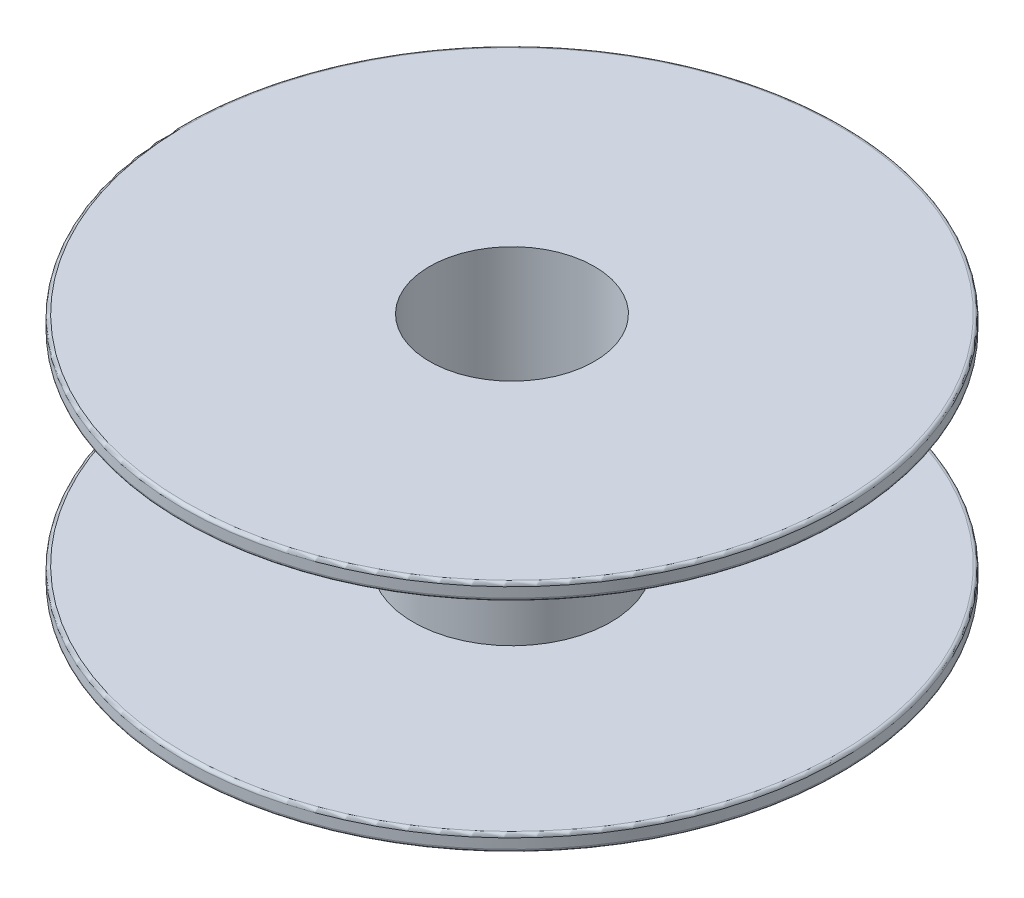
ISO-10303-21;
HEADER;
FILE_DESCRIPTION(('STEP AP214'),'2;1');
FILE_NAME('part.step','',(''),(''),'','','');
FILE_SCHEMA(('AUTOMOTIVE_DESIGN { 1 0 10303 214 1 1 1 1 }'));
ENDSEC;
DATA;
#1=APPLICATION_CONTEXT('core data for automotive mechanical design processes');
#2=APPLICATION_PROTOCOL_DEFINITION('international standard','automotive_design',2000,#1);
#3=PRODUCT_CONTEXT('',#1,'mechanical');
#4=PRODUCT('Part','Part','',(#3));
#5=PRODUCT_RELATED_PRODUCT_CATEGORY('part','',(#4));
#6=PRODUCT_DEFINITION_FORMATION('','',#4);
#7=PRODUCT_DEFINITION_CONTEXT('part definition',#1,'design');
#8=PRODUCT_DEFINITION('design','',#6,#7);
#9=PRODUCT_DEFINITION_SHAPE('','',#8);
#10=(LENGTH_UNIT() NAMED_UNIT(*) SI_UNIT(.MILLI.,.METRE.));
#11=(NAMED_UNIT(*) PLANE_ANGLE_UNIT() SI_UNIT($,.RADIAN.));
#12=(NAMED_UNIT(*) SI_UNIT($,.STERADIAN.) SOLID_ANGLE_UNIT());
#13=UNCERTAINTY_MEASURE_WITH_UNIT(LENGTH_MEASURE(1.E-05),#10,'distance_accuracy_value','');
#14=(GEOMETRIC_REPRESENTATION_CONTEXT(3) GLOBAL_UNCERTAINTY_ASSIGNED_CONTEXT((#13)) GLOBAL_UNIT_ASSIGNED_CONTEXT((#10,
#11,#12)) REPRESENTATION_CONTEXT('',''));
#15=CARTESIAN_POINT('',(0.,0.,0.));
#16=DIRECTION('',(0.,0.,1.));
#17=DIRECTION('',(1.,0.,0.));
#18=AXIS2_PLACEMENT_3D('',#15,#16,#17);
#19=CARTESIAN_POINT('',(0.,0.,0.));
#20=DIRECTION('',(0.,-1.,0.));
#21=DIRECTION('',(0.,0.,-1.));
#22=AXIS2_PLACEMENT_3D('',#19,#20,#21);
#23=CYLINDRICAL_SURFACE('',#22,25.);
#24=CARTESIAN_POINT('',(0.,0.,0.));
#25=DIRECTION('',(0.,-1.,0.));
#26=DIRECTION('',(0.,0.,-1.));
#27=AXIS2_PLACEMENT_3D('',#24,#25,#26);
#28=CIRCLE('',#27,25.);
#29=CARTESIAN_POINT('',(0.,0.,-25.));
#30=VERTEX_POINT('',#29);
#31=EDGE_CURVE('E65',#30,#30,#28,.T.);
#32=ORIENTED_EDGE('',*,*,#31,.T.);
#33=EDGE_LOOP('',(#32));
#34=FACE_BOUND('',#33,.T.);
#35=CARTESIAN_POINT('',(0.,71.,0.));
#36=DIRECTION('',(0.,-1.,0.));
#37=DIRECTION('',(0.,0.,-1.));
#38=AXIS2_PLACEMENT_3D('',#35,#36,#37);
#39=CIRCLE('',#38,25.);
#40=CARTESIAN_POINT('',(0.,71.,-25.));
#41=VERTEX_POINT('',#40);
#42=EDGE_CURVE('E74',#41,#41,#39,.T.);
#43=ORIENTED_EDGE('',*,*,#42,.F.);
#44=EDGE_LOOP('',(#43));
#45=FACE_BOUND('',#44,.T.);
#46=ADVANCED_FACE('F33',(#34,#45),#23,.F.);
#47=CARTESIAN_POINT('',(0.,0.,-25.));
#48=DIRECTION('',(0.,-1.,0.));
#49=DIRECTION('',(0.,0.,-1.));
#50=AXIS2_PLACEMENT_3D('',#47,#48,#49);
#51=PLANE('',#50);
#52=CARTESIAN_POINT('',(0.,0.,0.));
#53=DIRECTION('',(0.,-1.,0.));
#54=DIRECTION('',(0.,0.,-1.));
#55=AXIS2_PLACEMENT_3D('',#52,#53,#54);
#56=CIRCLE('',#55,99.);
#57=CARTESIAN_POINT('',(0.,0.,-99.));
#58=VERTEX_POINT('',#57);
#59=EDGE_CURVE('E62',#58,#58,#56,.T.);
#60=ORIENTED_EDGE('',*,*,#59,.T.);
#61=EDGE_LOOP('',(#60));
#62=FACE_BOUND('',#61,.T.);
#63=ORIENTED_EDGE('',*,*,#31,.F.);
#64=EDGE_LOOP('',(#63));
#65=FACE_BOUND('',#64,.T.);
#66=ADVANCED_FACE('F81',(#62,#65),#51,.T.);
#67=CARTESIAN_POINT('',(0.,0.,0.));
#68=DIRECTION('',(0.,-1.,0.));
#69=DIRECTION('',(0.,0.,-1.));
#70=AXIS2_PLACEMENT_3D('',#67,#68,#69);
#71=CYLINDRICAL_SURFACE('',#70,100.);
#72=CARTESIAN_POINT('',(0.,1.,0.));
#73=DIRECTION('',(0.,-1.,0.));
#74=DIRECTION('',(0.,0.,-1.));
#75=AXIS2_PLACEMENT_3D('',#72,#73,#74);
#76=CIRCLE('',#75,100.);
#77=CARTESIAN_POINT('',(0.,1.,-100.));
#78=VERTEX_POINT('',#77);
#79=EDGE_CURVE('E56',#78,#78,#76,.F.);
#80=ORIENTED_EDGE('',*,*,#79,.T.);
#81=EDGE_LOOP('',(#80));
#82=FACE_BOUND('',#81,.T.);
#83=CARTESIAN_POINT('',(0.,4.,0.));
#84=DIRECTION('',(0.,1.,0.));
#85=DIRECTION('',(0.,0.,1.));
#86=AXIS2_PLACEMENT_3D('',#83,#84,#85);
#87=CIRCLE('',#86,100.);
#88=CARTESIAN_POINT('',(0.,4.,100.));
#89=VERTEX_POINT('',#88);
#90=EDGE_CURVE('E59',#89,#89,#87,.F.);
#91=ORIENTED_EDGE('',*,*,#90,.T.);
#92=EDGE_LOOP('',(#91));
#93=FACE_BOUND('',#92,.T.);
#94=ADVANCED_FACE('F87',(#82,#93),#71,.T.);
#95=CARTESIAN_POINT('',(0.,5.,-100.));
#96=DIRECTION('',(0.,1.,0.));
#97=DIRECTION('',(0.,0.,1.));
#98=AXIS2_PLACEMENT_3D('',#95,#96,#97);
#99=PLANE('',#98);
#100=CARTESIAN_POINT('',(0.,5.,0.));
#101=DIRECTION('',(0.,1.,0.));
#102=DIRECTION('',(0.,0.,1.));
#103=AXIS2_PLACEMENT_3D('',#100,#101,#102);
#104=CIRCLE('',#103,99.);
#105=CARTESIAN_POINT('',(0.,5.,99.));
#106=VERTEX_POINT('',#105);
#107=EDGE_CURVE('E53',#106,#106,#104,.T.);
#108=ORIENTED_EDGE('',*,*,#107,.T.);
#109=EDGE_LOOP('',(#108));
#110=FACE_BOUND('',#109,.T.);
#111=CARTESIAN_POINT('',(0.,4.99999999999999,0.));
#112=DIRECTION('',(0.,-1.,0.));
#113=DIRECTION('',(0.,0.,-1.));
#114=AXIS2_PLACEMENT_3D('',#111,#112,#113);
#115=CIRCLE('',#114,30.);
#116=CARTESIAN_POINT('',(0.,4.99999999999999,-30.));
#117=VERTEX_POINT('',#116);
#118=EDGE_CURVE('E68',#117,#117,#115,.T.);
#119=ORIENTED_EDGE('',*,*,#118,.T.);
#120=EDGE_LOOP('',(#119));
#121=FACE_BOUND('',#120,.T.);
#122=ADVANCED_FACE('F119',(#110,#121),#99,.T.);
#123=CARTESIAN_POINT('',(0.,0.,0.));
#124=DIRECTION('',(0.,-1.,0.));
#125=DIRECTION('',(0.,0.,-1.));
#126=AXIS2_PLACEMENT_3D('',#123,#124,#125);
#127=CYLINDRICAL_SURFACE('',#126,30.);
#128=CARTESIAN_POINT('',(0.,66.,0.));
#129=DIRECTION('',(0.,-1.,0.));
#130=DIRECTION('',(0.,0.,-1.));
#131=AXIS2_PLACEMENT_3D('',#128,#129,#130);
#132=CIRCLE('',#131,30.);
#133=CARTESIAN_POINT('',(0.,66.,-30.));
#134=VERTEX_POINT('',#133);
#135=EDGE_CURVE('E71',#134,#134,#132,.T.);
#136=ORIENTED_EDGE('',*,*,#135,.T.);
#137=EDGE_LOOP('',(#136));
#138=FACE_BOUND('',#137,.T.);
#139=ORIENTED_EDGE('',*,*,#118,.F.);
#140=EDGE_LOOP('',(#139));
#141=FACE_BOUND('',#140,.T.);
#142=ADVANCED_FACE('F113',(#138,#141),#127,.T.);
#143=CARTESIAN_POINT('',(0.,66.,-30.));
#144=DIRECTION('',(0.,-1.,0.));
#145=DIRECTION('',(0.,0.,-1.));
#146=AXIS2_PLACEMENT_3D('',#143,#144,#145);
#147=PLANE('',#146);
#148=CARTESIAN_POINT('',(0.,66.,0.));
#149=DIRECTION('',(0.,-1.,0.));
#150=DIRECTION('',(0.,0.,-1.));
#151=AXIS2_PLACEMENT_3D('',#148,#149,#150);
#152=CIRCLE('',#151,99.);
#153=CARTESIAN_POINT('',(0.,66.,-99.));
#154=VERTEX_POINT('',#153);
#155=EDGE_CURVE('E48',#154,#154,#152,.T.);
#156=ORIENTED_EDGE('',*,*,#155,.T.);
#157=EDGE_LOOP('',(#156));
#158=FACE_BOUND('',#157,.T.);
#159=ORIENTED_EDGE('',*,*,#135,.F.);
#160=EDGE_LOOP('',(#159));
#161=FACE_BOUND('',#160,.T.);
#162=ADVANCED_FACE('F109',(#158,#161),#147,.T.);
#163=CARTESIAN_POINT('',(0.,0.,0.));
#164=DIRECTION('',(0.,-1.,0.));
#165=DIRECTION('',(0.,0.,-1.));
#166=AXIS2_PLACEMENT_3D('',#163,#164,#165);
#167=CYLINDRICAL_SURFACE('',#166,100.);
#168=CARTESIAN_POINT('',(0.,67.,0.));
#169=DIRECTION('',(0.,-1.,0.));
#170=DIRECTION('',(0.,0.,-1.));
#171=AXIS2_PLACEMENT_3D('',#168,#169,#170);
#172=CIRCLE('',#171,100.);
#173=CARTESIAN_POINT('',(0.,67.,-100.));
#174=VERTEX_POINT('',#173);
#175=EDGE_CURVE('E40',#174,#174,#172,.F.);
#176=ORIENTED_EDGE('',*,*,#175,.T.);
#177=EDGE_LOOP('',(#176));
#178=FACE_BOUND('',#177,.T.);
#179=CARTESIAN_POINT('',(0.,70.,0.));
#180=DIRECTION('',(0.,1.,0.));
#181=DIRECTION('',(0.,0.,1.));
#182=AXIS2_PLACEMENT_3D('',#179,#180,#181);
#183=CIRCLE('',#182,100.);
#184=CARTESIAN_POINT('',(0.,70.,100.));
#185=VERTEX_POINT('',#184);
#186=EDGE_CURVE('E44',#185,#185,#183,.F.);
#187=ORIENTED_EDGE('',*,*,#186,.T.);
#188=EDGE_LOOP('',(#187));
#189=FACE_BOUND('',#188,.T.);
#190=ADVANCED_FACE('F112',(#178,#189),#167,.T.);
#191=CARTESIAN_POINT('',(0.,71.,-100.));
#192=DIRECTION('',(0.,1.,0.));
#193=DIRECTION('',(0.,0.,1.));
#194=AXIS2_PLACEMENT_3D('',#191,#192,#193);
#195=PLANE('',#194);
#196=CARTESIAN_POINT('',(0.,71.,0.));
#197=DIRECTION('',(0.,1.,0.));
#198=DIRECTION('',(0.,0.,1.));
#199=AXIS2_PLACEMENT_3D('',#196,#197,#198);
#200=CIRCLE('',#199,99.);
#201=CARTESIAN_POINT('',(0.,71.,99.));
#202=VERTEX_POINT('',#201);
#203=EDGE_CURVE('E10',#202,#202,#200,.T.);
#204=ORIENTED_EDGE('',*,*,#203,.T.);
#205=EDGE_LOOP('',(#204));
#206=FACE_BOUND('',#205,.T.);
#207=ORIENTED_EDGE('',*,*,#42,.T.);
#208=EDGE_LOOP('',(#207));
#209=FACE_BOUND('',#208,.T.);
#210=ADVANCED_FACE('F78',(#206,#209),#195,.T.);
#211=CARTESIAN_POINT('',(0.,1.,0.));
#212=DIRECTION('',(0.,-1.,0.));
#213=DIRECTION('',(0.,0.,-1.));
#214=AXIS2_PLACEMENT_3D('',#211,#212,#213);
#215=TOROIDAL_SURFACE('',#214,99.,1.);
#216=ORIENTED_EDGE('',*,*,#79,.F.);
#217=EDGE_LOOP('',(#216));
#218=FACE_BOUND('',#217,.T.);
#219=ORIENTED_EDGE('',*,*,#59,.F.);
#220=EDGE_LOOP('',(#219));
#221=FACE_BOUND('',#220,.T.);
#222=ADVANCED_FACE('F92',(#218,#221),#215,.T.);
#223=CARTESIAN_POINT('',(0.,4.,0.));
#224=DIRECTION('',(0.,1.,0.));
#225=DIRECTION('',(0.,0.,1.));
#226=AXIS2_PLACEMENT_3D('',#223,#224,#225);
#227=TOROIDAL_SURFACE('',#226,99.,1.);
#228=ORIENTED_EDGE('',*,*,#107,.F.);
#229=EDGE_LOOP('',(#228));
#230=FACE_BOUND('',#229,.T.);
#231=ORIENTED_EDGE('',*,*,#90,.F.);
#232=EDGE_LOOP('',(#231));
#233=FACE_BOUND('',#232,.T.);
#234=ADVANCED_FACE('F95',(#230,#233),#227,.T.);
#235=CARTESIAN_POINT('',(0.,67.,0.));
#236=DIRECTION('',(0.,-1.,0.));
#237=DIRECTION('',(0.,0.,-1.));
#238=AXIS2_PLACEMENT_3D('',#235,#236,#237);
#239=TOROIDAL_SURFACE('',#238,99.,1.);
#240=ORIENTED_EDGE('',*,*,#175,.F.);
#241=EDGE_LOOP('',(#240));
#242=FACE_BOUND('',#241,.T.);
#243=ORIENTED_EDGE('',*,*,#155,.F.);
#244=EDGE_LOOP('',(#243));
#245=FACE_BOUND('',#244,.T.);
#246=ADVANCED_FACE('F98',(#242,#245),#239,.T.);
#247=CARTESIAN_POINT('',(0.,70.,0.));
#248=DIRECTION('',(0.,1.,0.));
#249=DIRECTION('',(0.,0.,1.));
#250=AXIS2_PLACEMENT_3D('',#247,#248,#249);
#251=TOROIDAL_SURFACE('',#250,99.,1.);
#252=ORIENTED_EDGE('',*,*,#203,.F.);
#253=EDGE_LOOP('',(#252));
#254=FACE_BOUND('',#253,.T.);
#255=ORIENTED_EDGE('',*,*,#186,.F.);
#256=EDGE_LOOP('',(#255));
#257=FACE_BOUND('',#256,.T.);
#258=ADVANCED_FACE('F35',(#254,#257),#251,.T.);
#259=CLOSED_SHELL('',(#46,#66,#94,#122,#142,#162,#190,#210,#222,#234,#246,#258));
#260=MANIFOLD_SOLID_BREP('B2',#259);
#261=ADVANCED_BREP_SHAPE_REPRESENTATION('',(#18,#260),#14);
#262=SHAPE_DEFINITION_REPRESENTATION(#9,#261);
ENDSEC;
END-ISO-10303-21;
